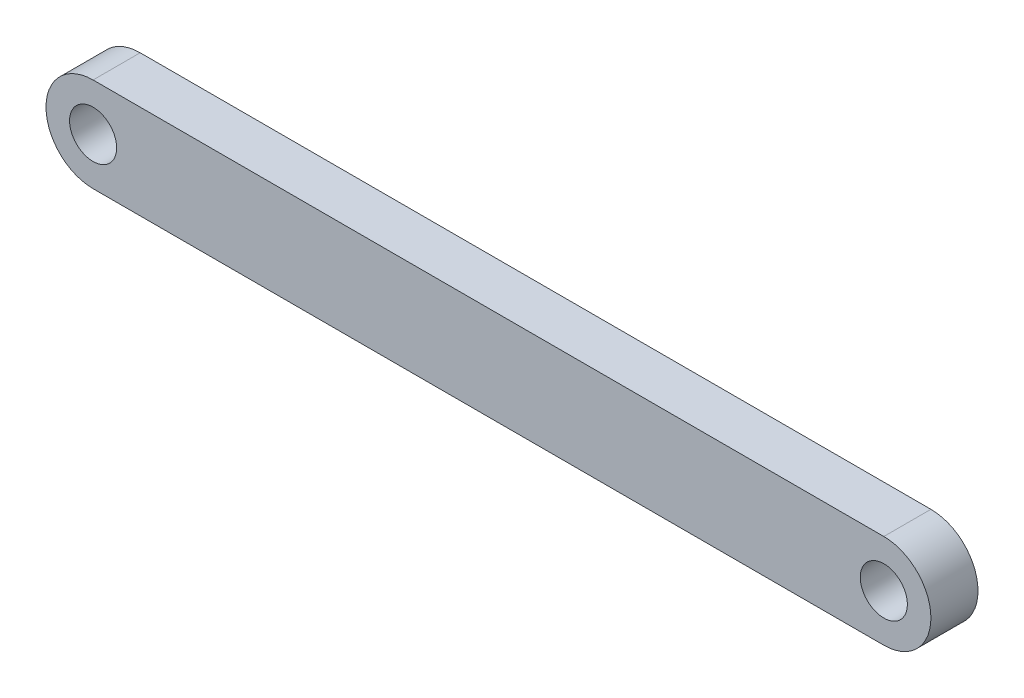
ISO-10303-21;
HEADER;
FILE_DESCRIPTION(('STEP AP214'),'2;1');
FILE_NAME('part.step','',(''),(''),'','','');
FILE_SCHEMA(('AUTOMOTIVE_DESIGN { 1 0 10303 214 1 1 1 1 }'));
ENDSEC;
DATA;
#1=APPLICATION_CONTEXT('core data for automotive mechanical design processes');
#2=APPLICATION_PROTOCOL_DEFINITION('international standard','automotive_design',2000,#1);
#3=PRODUCT_CONTEXT('',#1,'mechanical');
#4=PRODUCT('Part','Part','',(#3));
#5=PRODUCT_RELATED_PRODUCT_CATEGORY('part','',(#4));
#6=PRODUCT_DEFINITION_FORMATION('','',#4);
#7=PRODUCT_DEFINITION_CONTEXT('part definition',#1,'design');
#8=PRODUCT_DEFINITION('design','',#6,#7);
#9=PRODUCT_DEFINITION_SHAPE('','',#8);
#10=(LENGTH_UNIT() NAMED_UNIT(*) SI_UNIT(.MILLI.,.METRE.));
#11=(NAMED_UNIT(*) PLANE_ANGLE_UNIT() SI_UNIT($,.RADIAN.));
#12=(NAMED_UNIT(*) SI_UNIT($,.STERADIAN.) SOLID_ANGLE_UNIT());
#13=UNCERTAINTY_MEASURE_WITH_UNIT(LENGTH_MEASURE(1.E-05),#10,'distance_accuracy_value','');
#14=(GEOMETRIC_REPRESENTATION_CONTEXT(3) GLOBAL_UNCERTAINTY_ASSIGNED_CONTEXT((#13)) GLOBAL_UNIT_ASSIGNED_CONTEXT((#10,
#11,#12)) REPRESENTATION_CONTEXT('',''));
#15=CARTESIAN_POINT('',(0.,0.,0.));
#16=DIRECTION('',(0.,0.,1.));
#17=DIRECTION('',(1.,0.,0.));
#18=AXIS2_PLACEMENT_3D('',#15,#16,#17);
#19=CARTESIAN_POINT('',(41.98,0.,5.));
#20=DIRECTION('',(0.,0.,-1.));
#21=DIRECTION('',(-1.,0.,0.));
#22=AXIS2_PLACEMENT_3D('',#19,#20,#21);
#23=PLANE('',#22);
#24=CARTESIAN_POINT('',(41.98,0.,5.));
#25=DIRECTION('',(0.,0.,1.));
#26=DIRECTION('',(-1.,0.,0.));
#27=AXIS2_PLACEMENT_3D('',#24,#25,#26);
#28=CIRCLE('',#27,5.);
#29=CARTESIAN_POINT('',(41.98,-5.,5.));
#30=VERTEX_POINT('',#29);
#31=CARTESIAN_POINT('',(41.98,5.,5.));
#32=VERTEX_POINT('',#31);
#33=EDGE_CURVE('E96',#30,#32,#28,.T.);
#34=ORIENTED_EDGE('',*,*,#33,.T.);
#35=DIRECTION('',(-1.,0.,0.));
#36=VECTOR('',#35,1.);
#37=CARTESIAN_POINT('',(-41.98,5.,5.));
#38=LINE('',#37,#36);
#39=CARTESIAN_POINT('',(-41.98,5.,5.));
#40=VERTEX_POINT('',#39);
#41=EDGE_CURVE('E91',#32,#40,#38,.T.);
#42=ORIENTED_EDGE('',*,*,#41,.T.);
#43=CARTESIAN_POINT('',(-41.98,0.,5.));
#44=DIRECTION('',(0.,0.,1.));
#45=DIRECTION('',(1.,0.,0.));
#46=AXIS2_PLACEMENT_3D('',#43,#44,#45);
#47=CIRCLE('',#46,5.);
#48=CARTESIAN_POINT('',(-41.98,-5.,5.));
#49=VERTEX_POINT('',#48);
#50=EDGE_CURVE('E94',#40,#49,#47,.T.);
#51=ORIENTED_EDGE('',*,*,#50,.T.);
#52=DIRECTION('',(1.,0.,0.));
#53=VECTOR('',#52,1.);
#54=CARTESIAN_POINT('',(-41.98,-5.,5.));
#55=LINE('',#54,#53);
#56=EDGE_CURVE('E61',#49,#30,#55,.T.);
#57=ORIENTED_EDGE('',*,*,#56,.T.);
#58=EDGE_LOOP('',(#34,#42,#51,#57));
#59=FACE_BOUND('',#58,.T.);
#60=CARTESIAN_POINT('',(-41.98,0.,5.));
#61=DIRECTION('',(0.,0.,1.));
#62=DIRECTION('',(1.,0.,0.));
#63=AXIS2_PLACEMENT_3D('',#60,#61,#62);
#64=CIRCLE('',#63,2.5);
#65=CARTESIAN_POINT('',(-39.48,0.,5.));
#66=VERTEX_POINT('',#65);
#67=EDGE_CURVE('E116',#66,#66,#64,.T.);
#68=ORIENTED_EDGE('',*,*,#67,.F.);
#69=EDGE_LOOP('',(#68));
#70=FACE_BOUND('',#69,.T.);
#71=CARTESIAN_POINT('',(41.98,0.,5.));
#72=DIRECTION('',(0.,0.,1.));
#73=DIRECTION('',(1.,0.,0.));
#74=AXIS2_PLACEMENT_3D('',#71,#72,#73);
#75=CIRCLE('',#74,2.5);
#76=CARTESIAN_POINT('',(44.48,0.,5.));
#77=VERTEX_POINT('',#76);
#78=EDGE_CURVE('E138',#77,#77,#75,.T.);
#79=ORIENTED_EDGE('',*,*,#78,.F.);
#80=EDGE_LOOP('',(#79));
#81=FACE_BOUND('',#80,.T.);
#82=ADVANCED_FACE('F43',(#59,#70,#81),#23,.F.);
#83=CARTESIAN_POINT('',(41.98,0.,0.));
#84=DIRECTION('',(0.,0.,-1.));
#85=DIRECTION('',(-1.,0.,0.));
#86=AXIS2_PLACEMENT_3D('',#83,#84,#85);
#87=PLANE('',#86);
#88=CARTESIAN_POINT('',(-41.98,0.,0.));
#89=DIRECTION('',(0.,0.,1.));
#90=DIRECTION('',(1.,0.,0.));
#91=AXIS2_PLACEMENT_3D('',#88,#89,#90);
#92=CIRCLE('',#91,2.5);
#93=CARTESIAN_POINT('',(-39.48,0.,0.));
#94=VERTEX_POINT('',#93);
#95=EDGE_CURVE('E134',#94,#94,#92,.T.);
#96=ORIENTED_EDGE('',*,*,#95,.T.);
#97=EDGE_LOOP('',(#96));
#98=FACE_BOUND('',#97,.T.);
#99=CARTESIAN_POINT('',(41.98,0.,0.));
#100=DIRECTION('',(0.,0.,1.));
#101=DIRECTION('',(-1.,0.,0.));
#102=AXIS2_PLACEMENT_3D('',#99,#100,#101);
#103=CIRCLE('',#102,5.);
#104=CARTESIAN_POINT('',(41.98,-5.,0.));
#105=VERTEX_POINT('',#104);
#106=CARTESIAN_POINT('',(41.98,5.,0.));
#107=VERTEX_POINT('',#106);
#108=EDGE_CURVE('E112',#105,#107,#103,.T.);
#109=ORIENTED_EDGE('',*,*,#108,.F.);
#110=DIRECTION('',(1.,0.,0.));
#111=VECTOR('',#110,1.);
#112=CARTESIAN_POINT('',(-41.98,-5.,0.));
#113=LINE('',#112,#111);
#114=CARTESIAN_POINT('',(-41.98,-5.,0.));
#115=VERTEX_POINT('',#114);
#116=EDGE_CURVE('E84',#115,#105,#113,.T.);
#117=ORIENTED_EDGE('',*,*,#116,.F.);
#118=CARTESIAN_POINT('',(-41.98,0.,0.));
#119=DIRECTION('',(0.,0.,1.));
#120=DIRECTION('',(1.,0.,0.));
#121=AXIS2_PLACEMENT_3D('',#118,#119,#120);
#122=CIRCLE('',#121,5.);
#123=CARTESIAN_POINT('',(-41.98,5.,0.));
#124=VERTEX_POINT('',#123);
#125=EDGE_CURVE('E78',#124,#115,#122,.T.);
#126=ORIENTED_EDGE('',*,*,#125,.F.);
#127=DIRECTION('',(-1.,0.,0.));
#128=VECTOR('',#127,1.);
#129=CARTESIAN_POINT('',(-41.98,5.,0.));
#130=LINE('',#129,#128);
#131=EDGE_CURVE('E101',#107,#124,#130,.T.);
#132=ORIENTED_EDGE('',*,*,#131,.F.);
#133=EDGE_LOOP('',(#109,#117,#126,#132));
#134=FACE_BOUND('',#133,.T.);
#135=CARTESIAN_POINT('',(41.98,0.,0.));
#136=DIRECTION('',(0.,0.,1.));
#137=DIRECTION('',(1.,0.,0.));
#138=AXIS2_PLACEMENT_3D('',#135,#136,#137);
#139=CIRCLE('',#138,2.5);
#140=CARTESIAN_POINT('',(44.48,0.,0.));
#141=VERTEX_POINT('',#140);
#142=EDGE_CURVE('E142',#141,#141,#139,.T.);
#143=ORIENTED_EDGE('',*,*,#142,.T.);
#144=EDGE_LOOP('',(#143));
#145=FACE_BOUND('',#144,.T.);
#146=ADVANCED_FACE('F129',(#98,#134,#145),#87,.T.);
#147=CARTESIAN_POINT('',(41.98,0.,5.));
#148=DIRECTION('',(0.,0.,-1.));
#149=DIRECTION('',(-1.,0.,0.));
#150=AXIS2_PLACEMENT_3D('',#147,#148,#149);
#151=CYLINDRICAL_SURFACE('',#150,5.);
#152=ORIENTED_EDGE('',*,*,#108,.T.);
#153=DIRECTION('',(0.,0.,-1.));
#154=VECTOR('',#153,1.);
#155=CARTESIAN_POINT('',(41.98,5.,5.));
#156=LINE('',#155,#154);
#157=EDGE_CURVE('E11',#32,#107,#156,.T.);
#158=ORIENTED_EDGE('',*,*,#157,.F.);
#159=ORIENTED_EDGE('',*,*,#33,.F.);
#160=DIRECTION('',(0.,0.,-1.));
#161=VECTOR('',#160,1.);
#162=CARTESIAN_POINT('',(41.98,-5.,5.));
#163=LINE('',#162,#161);
#164=EDGE_CURVE('E108',#30,#105,#163,.T.);
#165=ORIENTED_EDGE('',*,*,#164,.T.);
#166=EDGE_LOOP('',(#152,#158,#159,#165));
#167=FACE_BOUND('',#166,.T.);
#168=ADVANCED_FACE('F45',(#167),#151,.T.);
#169=CARTESIAN_POINT('',(-41.98,5.,5.));
#170=DIRECTION('',(0.,-1.,0.));
#171=DIRECTION('',(0.,0.,-1.));
#172=AXIS2_PLACEMENT_3D('',#169,#170,#171);
#173=PLANE('',#172);
#174=ORIENTED_EDGE('',*,*,#131,.T.);
#175=DIRECTION('',(0.,0.,-1.));
#176=VECTOR('',#175,1.);
#177=CARTESIAN_POINT('',(-41.98,5.,5.));
#178=LINE('',#177,#176);
#179=EDGE_CURVE('E53',#40,#124,#178,.T.);
#180=ORIENTED_EDGE('',*,*,#179,.F.);
#181=ORIENTED_EDGE('',*,*,#41,.F.);
#182=ORIENTED_EDGE('',*,*,#157,.T.);
#183=EDGE_LOOP('',(#174,#180,#181,#182));
#184=FACE_BOUND('',#183,.T.);
#185=ADVANCED_FACE('F100',(#184),#173,.F.);
#186=CARTESIAN_POINT('',(-41.98,0.,5.));
#187=DIRECTION('',(0.,0.,-1.));
#188=DIRECTION('',(-1.,0.,0.));
#189=AXIS2_PLACEMENT_3D('',#186,#187,#188);
#190=CYLINDRICAL_SURFACE('',#189,5.);
#191=ORIENTED_EDGE('',*,*,#125,.T.);
#192=DIRECTION('',(0.,0.,-1.));
#193=VECTOR('',#192,1.);
#194=CARTESIAN_POINT('',(-41.98,-5.,5.));
#195=LINE('',#194,#193);
#196=EDGE_CURVE('E103',#49,#115,#195,.T.);
#197=ORIENTED_EDGE('',*,*,#196,.F.);
#198=ORIENTED_EDGE('',*,*,#50,.F.);
#199=ORIENTED_EDGE('',*,*,#179,.T.);
#200=EDGE_LOOP('',(#191,#197,#198,#199));
#201=FACE_BOUND('',#200,.T.);
#202=ADVANCED_FACE('F104',(#201),#190,.T.);
#203=CARTESIAN_POINT('',(-41.98,-5.,5.));
#204=DIRECTION('',(0.,1.,0.));
#205=DIRECTION('',(0.,0.,1.));
#206=AXIS2_PLACEMENT_3D('',#203,#204,#205);
#207=PLANE('',#206);
#208=ORIENTED_EDGE('',*,*,#116,.T.);
#209=ORIENTED_EDGE('',*,*,#164,.F.);
#210=ORIENTED_EDGE('',*,*,#56,.F.);
#211=ORIENTED_EDGE('',*,*,#196,.T.);
#212=EDGE_LOOP('',(#208,#209,#210,#211));
#213=FACE_BOUND('',#212,.T.);
#214=ADVANCED_FACE('F126',(#213),#207,.F.);
#215=CARTESIAN_POINT('',(-41.98,0.,5.));
#216=DIRECTION('',(0.,0.,-1.));
#217=DIRECTION('',(-1.,0.,0.));
#218=AXIS2_PLACEMENT_3D('',#215,#216,#217);
#219=CYLINDRICAL_SURFACE('',#218,2.5);
#220=ORIENTED_EDGE('',*,*,#67,.T.);
#221=EDGE_LOOP('',(#220));
#222=FACE_BOUND('',#221,.T.);
#223=ORIENTED_EDGE('',*,*,#95,.F.);
#224=EDGE_LOOP('',(#223));
#225=FACE_BOUND('',#224,.T.);
#226=ADVANCED_FACE('F161',(#222,#225),#219,.F.);
#227=CARTESIAN_POINT('',(41.98,0.,5.));
#228=DIRECTION('',(0.,0.,-1.));
#229=DIRECTION('',(-1.,0.,0.));
#230=AXIS2_PLACEMENT_3D('',#227,#228,#229);
#231=CYLINDRICAL_SURFACE('',#230,2.5);
#232=ORIENTED_EDGE('',*,*,#78,.T.);
#233=EDGE_LOOP('',(#232));
#234=FACE_BOUND('',#233,.T.);
#235=ORIENTED_EDGE('',*,*,#142,.F.);
#236=EDGE_LOOP('',(#235));
#237=FACE_BOUND('',#236,.T.);
#238=ADVANCED_FACE('F150',(#234,#237),#231,.F.);
#239=CLOSED_SHELL('',(#82,#146,#168,#185,#202,#214,#226,#238));
#240=MANIFOLD_SOLID_BREP('B2',#239);
#241=ADVANCED_BREP_SHAPE_REPRESENTATION('',(#18,#240),#14);
#242=SHAPE_DEFINITION_REPRESENTATION(#9,#241);
ENDSEC;
END-ISO-10303-21;
